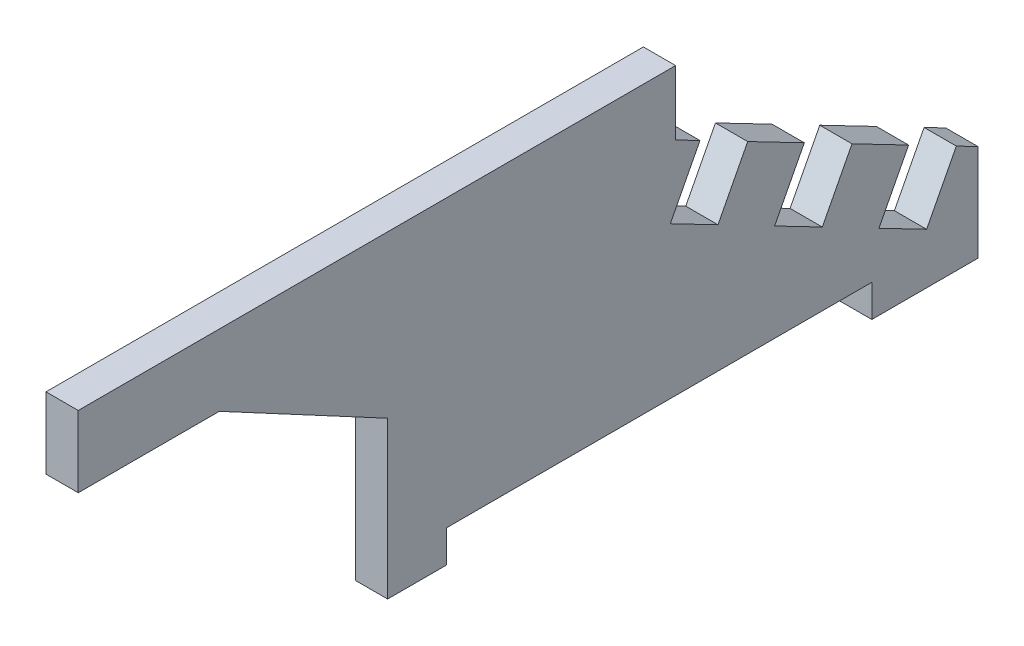
ISO-10303-21;
HEADER;
FILE_DESCRIPTION(('STEP AP214'),'2;1');
FILE_NAME('part.step','',(''),(''),'','','');
FILE_SCHEMA(('AUTOMOTIVE_DESIGN { 1 0 10303 214 1 1 1 1 }'));
ENDSEC;
DATA;
#1=APPLICATION_CONTEXT('core data for automotive mechanical design processes');
#2=APPLICATION_PROTOCOL_DEFINITION('international standard','automotive_design',2000,#1);
#3=PRODUCT_CONTEXT('',#1,'mechanical');
#4=PRODUCT('Part','Part','',(#3));
#5=PRODUCT_RELATED_PRODUCT_CATEGORY('part','',(#4));
#6=PRODUCT_DEFINITION_FORMATION('','',#4);
#7=PRODUCT_DEFINITION_CONTEXT('part definition',#1,'design');
#8=PRODUCT_DEFINITION('design','',#6,#7);
#9=PRODUCT_DEFINITION_SHAPE('','',#8);
#10=(LENGTH_UNIT() NAMED_UNIT(*) SI_UNIT(.MILLI.,.METRE.));
#11=(NAMED_UNIT(*) PLANE_ANGLE_UNIT() SI_UNIT($,.RADIAN.));
#12=(NAMED_UNIT(*) SI_UNIT($,.STERADIAN.) SOLID_ANGLE_UNIT());
#13=UNCERTAINTY_MEASURE_WITH_UNIT(LENGTH_MEASURE(1.E-05),#10,'distance_accuracy_value','');
#14=(GEOMETRIC_REPRESENTATION_CONTEXT(3) GLOBAL_UNCERTAINTY_ASSIGNED_CONTEXT((#13)) GLOBAL_UNIT_ASSIGNED_CONTEXT((#10,
#11,#12)) REPRESENTATION_CONTEXT('',''));
#15=CARTESIAN_POINT('',(0.,0.,0.));
#16=DIRECTION('',(0.,0.,1.));
#17=DIRECTION('',(1.,0.,0.));
#18=AXIS2_PLACEMENT_3D('',#15,#16,#17);
#19=CARTESIAN_POINT('',(3.,-19.9656088794069,23.405592814546));
#20=DIRECTION('',(0.,0.,-1.));
#21=DIRECTION('',(-1.,0.,0.));
#22=AXIS2_PLACEMENT_3D('',#19,#20,#21);
#23=PLANE('',#22);
#24=DIRECTION('',(0.,-1.,0.));
#25=VECTOR('',#24,1.);
#26=CARTESIAN_POINT('',(0.,-19.9656088794069,23.405592814546));
#27=LINE('',#26,#25);
#28=CARTESIAN_POINT('',(0.,-13.3287386111926,23.405592814546));
#29=VERTEX_POINT('',#28);
#30=CARTESIAN_POINT('',(0.,-19.9656088794069,23.405592814546));
#31=VERTEX_POINT('',#30);
#32=EDGE_CURVE('E276',#29,#31,#27,.T.);
#33=ORIENTED_EDGE('',*,*,#32,.T.);
#34=DIRECTION('',(-1.,0.,0.));
#35=VECTOR('',#34,1.);
#36=CARTESIAN_POINT('',(3.,-19.9656088794069,23.405592814546));
#37=LINE('',#36,#35);
#38=CARTESIAN_POINT('',(3.,-19.9656088794069,23.405592814546));
#39=VERTEX_POINT('',#38);
#40=EDGE_CURVE('E11',#39,#31,#37,.T.);
#41=ORIENTED_EDGE('',*,*,#40,.F.);
#42=DIRECTION('',(0.,-1.,0.));
#43=VECTOR('',#42,1.);
#44=CARTESIAN_POINT('',(3.,-19.9656088794069,23.405592814546));
#45=LINE('',#44,#43);
#46=CARTESIAN_POINT('',(3.,-13.3287386111926,23.405592814546));
#47=VERTEX_POINT('',#46);
#48=EDGE_CURVE('E343',#47,#39,#45,.T.);
#49=ORIENTED_EDGE('',*,*,#48,.F.);
#50=DIRECTION('',(-1.,0.,0.));
#51=VECTOR('',#50,1.);
#52=CARTESIAN_POINT('',(3.,-13.3287386111926,23.405592814546));
#53=LINE('',#52,#51);
#54=EDGE_CURVE('E272',#47,#29,#53,.T.);
#55=ORIENTED_EDGE('',*,*,#54,.T.);
#56=EDGE_LOOP('',(#33,#41,#49,#55));
#57=FACE_BOUND('',#56,.T.);
#58=ADVANCED_FACE('F39',(#57),#23,.F.);
#59=CARTESIAN_POINT('',(3.,-19.9656088794069,10.278235860692));
#60=DIRECTION('',(0.,1.,0.));
#61=DIRECTION('',(0.,0.,1.));
#62=AXIS2_PLACEMENT_3D('',#59,#60,#61);
#63=PLANE('',#62);
#64=DIRECTION('',(0.,0.,-1.));
#65=VECTOR('',#64,1.);
#66=CARTESIAN_POINT('',(0.,-19.9656088794069,10.278235860692));
#67=LINE('',#66,#65);
#68=CARTESIAN_POINT('',(0.,-19.9656088794069,10.278235860692));
#69=VERTEX_POINT('',#68);
#70=EDGE_CURVE('E280',#31,#69,#67,.T.);
#71=ORIENTED_EDGE('',*,*,#70,.T.);
#72=DIRECTION('',(-1.,0.,0.));
#73=VECTOR('',#72,1.);
#74=CARTESIAN_POINT('',(3.,-19.9656088794069,10.278235860692));
#75=LINE('',#74,#73);
#76=CARTESIAN_POINT('',(3.,-19.9656088794069,10.278235860692));
#77=VERTEX_POINT('',#76);
#78=EDGE_CURVE('E48',#77,#69,#75,.T.);
#79=ORIENTED_EDGE('',*,*,#78,.F.);
#80=DIRECTION('',(0.,0.,-1.));
#81=VECTOR('',#80,1.);
#82=CARTESIAN_POINT('',(3.,-19.9656088794069,10.278235860692));
#83=LINE('',#82,#81);
#84=EDGE_CURVE('E166',#39,#77,#83,.T.);
#85=ORIENTED_EDGE('',*,*,#84,.F.);
#86=ORIENTED_EDGE('',*,*,#40,.T.);
#87=EDGE_LOOP('',(#71,#79,#85,#86));
#88=FACE_BOUND('',#87,.T.);
#89=ADVANCED_FACE('F518',(#88),#63,.F.);
#90=CARTESIAN_POINT('',(3.,-28.3527475386568,-5.38733675730117));
#91=DIRECTION('',(0.,0.881600168687967,-0.471996973051044));
#92=DIRECTION('',(0.,0.471996973051044,0.881600168687967));
#93=AXIS2_PLACEMENT_3D('',#90,#91,#92);
#94=PLANE('',#93);
#95=DIRECTION('',(0.,-0.471996973051044,-0.881600168687967));
#96=VECTOR('',#95,1.);
#97=CARTESIAN_POINT('',(0.,-28.3527475386568,-5.38733675730117));
#98=LINE('',#97,#96);
#99=CARTESIAN_POINT('',(0.,-28.3527475386568,-5.38733675730117));
#100=VERTEX_POINT('',#99);
#101=EDGE_CURVE('E283',#69,#100,#98,.T.);
#102=ORIENTED_EDGE('',*,*,#101,.T.);
#103=DIRECTION('',(-1.,0.,0.));
#104=VECTOR('',#103,1.);
#105=CARTESIAN_POINT('',(3.,-28.3527475386568,-5.38733675730117));
#106=LINE('',#105,#104);
#107=CARTESIAN_POINT('',(3.,-28.3527475386568,-5.38733675730117));
#108=VERTEX_POINT('',#107);
#109=EDGE_CURVE('E416',#108,#100,#106,.T.);
#110=ORIENTED_EDGE('',*,*,#109,.F.);
#111=DIRECTION('',(0.,-0.471996973051044,-0.881600168687967));
#112=VECTOR('',#111,1.);
#113=CARTESIAN_POINT('',(3.,-28.3527475386568,-5.38733675730117));
#114=LINE('',#113,#112);
#115=EDGE_CURVE('E428',#77,#108,#114,.T.);
#116=ORIENTED_EDGE('',*,*,#115,.F.);
#117=ORIENTED_EDGE('',*,*,#78,.T.);
#118=EDGE_LOOP('',(#102,#110,#116,#117));
#119=FACE_BOUND('',#118,.T.);
#120=ADVANCED_FACE('F426',(#119),#94,.F.);
#121=CARTESIAN_POINT('',(3.,-39.9290637631004,-5.38733675730117));
#122=DIRECTION('',(0.,0.,-1.));
#123=DIRECTION('',(-1.,0.,0.));
#124=AXIS2_PLACEMENT_3D('',#121,#122,#123);
#125=PLANE('',#124);
#126=DIRECTION('',(0.,-1.,0.));
#127=VECTOR('',#126,1.);
#128=CARTESIAN_POINT('',(0.,-39.9290637631004,-5.38733675730117));
#129=LINE('',#128,#127);
#130=CARTESIAN_POINT('',(0.,-42.9290637631004,-5.38733675730117));
#131=VERTEX_POINT('',#130);
#132=EDGE_CURVE('E287',#100,#131,#129,.T.);
#133=ORIENTED_EDGE('',*,*,#132,.T.);
#134=DIRECTION('',(-1.,0.,0.));
#135=VECTOR('',#134,1.);
#136=CARTESIAN_POINT('',(3.,-42.9290637631004,-5.38733675730117));
#137=LINE('',#136,#135);
#138=CARTESIAN_POINT('',(3.,-42.9290637631004,-5.38733675730117));
#139=VERTEX_POINT('',#138);
#140=EDGE_CURVE('E412',#139,#131,#137,.T.);
#141=ORIENTED_EDGE('',*,*,#140,.F.);
#142=DIRECTION('',(0.,-1.,0.));
#143=VECTOR('',#142,1.);
#144=CARTESIAN_POINT('',(3.,-39.9290637631004,-5.38733675730117));
#145=LINE('',#144,#143);
#146=EDGE_CURVE('E446',#108,#139,#145,.T.);
#147=ORIENTED_EDGE('',*,*,#146,.F.);
#148=ORIENTED_EDGE('',*,*,#109,.T.);
#149=EDGE_LOOP('',(#133,#141,#147,#148));
#150=FACE_BOUND('',#149,.T.);
#151=ADVANCED_FACE('F436',(#150),#125,.F.);
#152=CARTESIAN_POINT('',(3.,-42.9290637631004,-5.38733675730117));
#153=DIRECTION('',(0.,1.,0.));
#154=DIRECTION('',(0.,0.,1.));
#155=AXIS2_PLACEMENT_3D('',#152,#153,#154);
#156=PLANE('',#155);
#157=DIRECTION('',(0.,0.,-1.));
#158=VECTOR('',#157,1.);
#159=CARTESIAN_POINT('',(0.,-42.9290637631004,-5.38733675730117));
#160=LINE('',#159,#158);
#161=CARTESIAN_POINT('',(0.,-42.9290637631004,-10.8500269527504));
#162=VERTEX_POINT('',#161);
#163=EDGE_CURVE('E290',#131,#162,#160,.T.);
#164=ORIENTED_EDGE('',*,*,#163,.T.);
#165=DIRECTION('',(-1.,0.,0.));
#166=VECTOR('',#165,1.);
#167=CARTESIAN_POINT('',(3.,-42.9290637631004,-10.8500269527504));
#168=LINE('',#167,#166);
#169=CARTESIAN_POINT('',(3.,-42.9290637631004,-10.8500269527504));
#170=VERTEX_POINT('',#169);
#171=EDGE_CURVE('E408',#170,#162,#168,.T.);
#172=ORIENTED_EDGE('',*,*,#171,.F.);
#173=DIRECTION('',(0.,0.,-1.));
#174=VECTOR('',#173,1.);
#175=CARTESIAN_POINT('',(3.,-42.9290637631004,-5.38733675730117));
#176=LINE('',#175,#174);
#177=EDGE_CURVE('E442',#139,#170,#176,.T.);
#178=ORIENTED_EDGE('',*,*,#177,.F.);
#179=ORIENTED_EDGE('',*,*,#140,.T.);
#180=EDGE_LOOP('',(#164,#172,#178,#179));
#181=FACE_BOUND('',#180,.T.);
#182=ADVANCED_FACE('F440',(#181),#156,.F.);
#183=CARTESIAN_POINT('',(3.,-39.9290637631004,-10.8500269527504));
#184=DIRECTION('',(0.,0.,1.));
#185=DIRECTION('',(1.,0.,0.));
#186=AXIS2_PLACEMENT_3D('',#183,#184,#185);
#187=PLANE('',#186);
#188=DIRECTION('',(0.,1.,0.));
#189=VECTOR('',#188,1.);
#190=CARTESIAN_POINT('',(0.,-39.9290637631004,-10.8500269527504));
#191=LINE('',#190,#189);
#192=CARTESIAN_POINT('',(0.,-39.9290637631004,-10.8500269527504));
#193=VERTEX_POINT('',#192);
#194=EDGE_CURVE('E293',#162,#193,#191,.T.);
#195=ORIENTED_EDGE('',*,*,#194,.T.);
#196=DIRECTION('',(-1.,0.,0.));
#197=VECTOR('',#196,1.);
#198=CARTESIAN_POINT('',(3.,-39.9290637631004,-10.8500269527504));
#199=LINE('',#198,#197);
#200=CARTESIAN_POINT('',(3.,-39.9290637631004,-10.8500269527504));
#201=VERTEX_POINT('',#200);
#202=EDGE_CURVE('E404',#201,#193,#199,.T.);
#203=ORIENTED_EDGE('',*,*,#202,.F.);
#204=DIRECTION('',(0.,1.,0.));
#205=VECTOR('',#204,1.);
#206=CARTESIAN_POINT('',(3.,-39.9290637631004,-10.8500269527504));
#207=LINE('',#206,#205);
#208=EDGE_CURVE('E445',#170,#201,#207,.T.);
#209=ORIENTED_EDGE('',*,*,#208,.F.);
#210=ORIENTED_EDGE('',*,*,#171,.T.);
#211=EDGE_LOOP('',(#195,#203,#209,#210));
#212=FACE_BOUND('',#211,.T.);
#213=ADVANCED_FACE('F531',(#212),#187,.F.);
#214=CARTESIAN_POINT('',(3.,-39.9290637631004,-50.4545308697576));
#215=DIRECTION('',(0.,1.,0.));
#216=DIRECTION('',(0.,0.,1.));
#217=AXIS2_PLACEMENT_3D('',#214,#215,#216);
#218=PLANE('',#217);
#219=DIRECTION('',(0.,0.,-1.));
#220=VECTOR('',#219,1.);
#221=CARTESIAN_POINT('',(0.,-39.9290637631004,-50.4545308697576));
#222=LINE('',#221,#220);
#223=CARTESIAN_POINT('',(0.,-39.9290637631004,-50.4545308697576));
#224=VERTEX_POINT('',#223);
#225=EDGE_CURVE('E296',#193,#224,#222,.T.);
#226=ORIENTED_EDGE('',*,*,#225,.T.);
#227=DIRECTION('',(-1.,0.,0.));
#228=VECTOR('',#227,1.);
#229=CARTESIAN_POINT('',(3.,-39.9290637631004,-50.4545308697576));
#230=LINE('',#229,#228);
#231=CARTESIAN_POINT('',(3.,-39.9290637631004,-50.4545308697576));
#232=VERTEX_POINT('',#231);
#233=EDGE_CURVE('E401',#232,#224,#230,.T.);
#234=ORIENTED_EDGE('',*,*,#233,.F.);
#235=DIRECTION('',(0.,0.,-1.));
#236=VECTOR('',#235,1.);
#237=CARTESIAN_POINT('',(3.,-39.9290637631004,-50.4545308697576));
#238=LINE('',#237,#236);
#239=EDGE_CURVE('E449',#201,#232,#238,.T.);
#240=ORIENTED_EDGE('',*,*,#239,.F.);
#241=ORIENTED_EDGE('',*,*,#202,.T.);
#242=EDGE_LOOP('',(#226,#234,#240,#241));
#243=FACE_BOUND('',#242,.T.);
#244=ADVANCED_FACE('F534',(#243),#218,.F.);
#245=CARTESIAN_POINT('',(3.,-39.9290637631004,-50.4545308697576));
#246=DIRECTION('',(0.,0.,-1.));
#247=DIRECTION('',(-1.,0.,0.));
#248=AXIS2_PLACEMENT_3D('',#245,#246,#247);
#249=PLANE('',#248);
#250=DIRECTION('',(0.,-1.,0.));
#251=VECTOR('',#250,1.);
#252=CARTESIAN_POINT('',(0.,-39.9290637631004,-50.4545308697576));
#253=LINE('',#252,#251);
#254=CARTESIAN_POINT('',(0.,-42.9290637631004,-50.4545308697576));
#255=VERTEX_POINT('',#254);
#256=EDGE_CURVE('E299',#224,#255,#253,.T.);
#257=ORIENTED_EDGE('',*,*,#256,.T.);
#258=DIRECTION('',(-1.,0.,0.));
#259=VECTOR('',#258,1.);
#260=CARTESIAN_POINT('',(3.,-42.9290637631004,-50.4545308697576));
#261=LINE('',#260,#259);
#262=CARTESIAN_POINT('',(3.,-42.9290637631004,-50.4545308697576));
#263=VERTEX_POINT('',#262);
#264=EDGE_CURVE('E398',#263,#255,#261,.T.);
#265=ORIENTED_EDGE('',*,*,#264,.F.);
#266=DIRECTION('',(0.,-1.,0.));
#267=VECTOR('',#266,1.);
#268=CARTESIAN_POINT('',(3.,-39.9290637631004,-50.4545308697576));
#269=LINE('',#268,#267);
#270=EDGE_CURVE('E456',#232,#263,#269,.T.);
#271=ORIENTED_EDGE('',*,*,#270,.F.);
#272=ORIENTED_EDGE('',*,*,#233,.T.);
#273=EDGE_LOOP('',(#257,#265,#271,#272));
#274=FACE_BOUND('',#273,.T.);
#275=ADVANCED_FACE('F538',(#274),#249,.F.);
#276=CARTESIAN_POINT('',(3.,-42.9290637631004,-50.4545308697576));
#277=DIRECTION('',(0.,1.,0.));
#278=DIRECTION('',(0.,0.,1.));
#279=AXIS2_PLACEMENT_3D('',#276,#277,#278);
#280=PLANE('',#279);
#281=DIRECTION('',(0.,0.,-1.));
#282=VECTOR('',#281,1.);
#283=CARTESIAN_POINT('',(0.,-42.9290637631004,-50.4545308697576));
#284=LINE('',#283,#282);
#285=CARTESIAN_POINT('',(0.,-42.9290637631004,-60.3362108869641));
#286=VERTEX_POINT('',#285);
#287=EDGE_CURVE('E301',#255,#286,#284,.T.);
#288=ORIENTED_EDGE('',*,*,#287,.T.);
#289=DIRECTION('',(-1.,0.,0.));
#290=VECTOR('',#289,1.);
#291=CARTESIAN_POINT('',(3.,-42.9290637631004,-60.3362108869641));
#292=LINE('',#291,#290);
#293=CARTESIAN_POINT('',(3.,-42.9290637631004,-60.3362108869641));
#294=VERTEX_POINT('',#293);
#295=EDGE_CURVE('E394',#294,#286,#292,.T.);
#296=ORIENTED_EDGE('',*,*,#295,.F.);
#297=DIRECTION('',(0.,0.,-1.));
#298=VECTOR('',#297,1.);
#299=CARTESIAN_POINT('',(3.,-42.9290637631004,-50.4545308697576));
#300=LINE('',#299,#298);
#301=EDGE_CURVE('E458',#263,#294,#300,.T.);
#302=ORIENTED_EDGE('',*,*,#301,.F.);
#303=ORIENTED_EDGE('',*,*,#264,.T.);
#304=EDGE_LOOP('',(#288,#296,#302,#303));
#305=FACE_BOUND('',#304,.T.);
#306=ADVANCED_FACE('F542',(#305),#280,.F.);
#307=CARTESIAN_POINT('',(3.,-33.9290637631004,-60.3362108869641));
#308=DIRECTION('',(0.,0.,1.));
#309=DIRECTION('',(1.,0.,0.));
#310=AXIS2_PLACEMENT_3D('',#307,#308,#309);
#311=PLANE('',#310);
#312=DIRECTION('',(0.,1.,0.));
#313=VECTOR('',#312,1.);
#314=CARTESIAN_POINT('',(0.,-33.9290637631004,-60.3362108869641));
#315=LINE('',#314,#313);
#316=CARTESIAN_POINT('',(0.,-33.9290637631004,-60.3362108869641));
#317=VERTEX_POINT('',#316);
#318=EDGE_CURVE('E304',#286,#317,#315,.T.);
#319=ORIENTED_EDGE('',*,*,#318,.T.);
#320=DIRECTION('',(-1.,0.,0.));
#321=VECTOR('',#320,1.);
#322=CARTESIAN_POINT('',(3.,-33.9290637631004,-60.3362108869641));
#323=LINE('',#322,#321);
#324=CARTESIAN_POINT('',(3.,-33.9290637631004,-60.3362108869641));
#325=VERTEX_POINT('',#324);
#326=EDGE_CURVE('E390',#325,#317,#323,.T.);
#327=ORIENTED_EDGE('',*,*,#326,.F.);
#328=DIRECTION('',(0.,1.,0.));
#329=VECTOR('',#328,1.);
#330=CARTESIAN_POINT('',(3.,-39.9290637631004,-60.3362108869641));
#331=LINE('',#330,#329);
#332=EDGE_CURVE('E461',#294,#325,#331,.T.);
#333=ORIENTED_EDGE('',*,*,#332,.F.);
#334=ORIENTED_EDGE('',*,*,#295,.T.);
#335=EDGE_LOOP('',(#319,#327,#333,#334));
#336=FACE_BOUND('',#335,.T.);
#337=ADVANCED_FACE('F546',(#336),#311,.F.);
#338=CARTESIAN_POINT('',(3.,-32.8821418997589,-58.318179141275));
#339=DIRECTION('',(0.,-0.887658340246798,0.460502628646461));
#340=DIRECTION('',(0.,-0.460502628646461,-0.887658340246798));
#341=AXIS2_PLACEMENT_3D('',#338,#339,#340);
#342=PLANE('',#341);
#343=DIRECTION('',(0.,0.460502628646461,0.887658340246798));
#344=VECTOR('',#343,1.);
#345=CARTESIAN_POINT('',(0.,-32.8821418997589,-58.318179141275));
#346=LINE('',#345,#344);
#347=CARTESIAN_POINT('',(0.,-32.8821418997589,-58.318179141275));
#348=VERTEX_POINT('',#347);
#349=EDGE_CURVE('E306',#317,#348,#346,.T.);
#350=ORIENTED_EDGE('',*,*,#349,.T.);
#351=DIRECTION('',(-1.,0.,0.));
#352=VECTOR('',#351,1.);
#353=CARTESIAN_POINT('',(3.,-32.8821418997589,-58.318179141275));
#354=LINE('',#353,#352);
#355=CARTESIAN_POINT('',(3.,-32.8821418997589,-58.318179141275));
#356=VERTEX_POINT('',#355);
#357=EDGE_CURVE('E386',#356,#348,#354,.T.);
#358=ORIENTED_EDGE('',*,*,#357,.F.);
#359=DIRECTION('',(0.,0.460502628646461,0.887658340246798));
#360=VECTOR('',#359,1.);
#361=CARTESIAN_POINT('',(3.,-32.8821418997589,-58.318179141275));
#362=LINE('',#361,#360);
#363=EDGE_CURVE('E464',#325,#356,#362,.T.);
#364=ORIENTED_EDGE('',*,*,#363,.F.);
#365=ORIENTED_EDGE('',*,*,#326,.T.);
#366=EDGE_LOOP('',(#350,#358,#364,#365));
#367=FACE_BOUND('',#366,.T.);
#368=ADVANCED_FACE('F550',(#367),#342,.F.);
#369=CARTESIAN_POINT('',(3.,-32.8821418997589,-58.318179141275));
#370=DIRECTION('',(0.,-0.460502628646458,-0.887658340246799));
#371=DIRECTION('',(0.,0.887658340246799,-0.460502628646458));
#372=AXIS2_PLACEMENT_3D('',#369,#370,#371);
#373=PLANE('',#372);
#374=DIRECTION('',(0.,-0.887658340246799,0.460502628646458));
#375=VECTOR('',#374,1.);
#376=CARTESIAN_POINT('',(0.,-32.8821418997589,-58.318179141275));
#377=LINE('',#376,#375);
#378=CARTESIAN_POINT('',(0.,-38.2080919412397,-55.5551633693962));
#379=VERTEX_POINT('',#378);
#380=EDGE_CURVE('E308',#348,#379,#377,.T.);
#381=ORIENTED_EDGE('',*,*,#380,.T.);
#382=DIRECTION('',(-1.,0.,0.));
#383=VECTOR('',#382,1.);
#384=CARTESIAN_POINT('',(3.,-38.2080919412397,-55.5551633693962));
#385=LINE('',#384,#383);
#386=CARTESIAN_POINT('',(3.,-38.2080919412397,-55.5551633693962));
#387=VERTEX_POINT('',#386);
#388=EDGE_CURVE('E382',#387,#379,#385,.T.);
#389=ORIENTED_EDGE('',*,*,#388,.F.);
#390=DIRECTION('',(0.,-0.887658340246799,0.460502628646458));
#391=VECTOR('',#390,1.);
#392=CARTESIAN_POINT('',(3.,-32.8821418997589,-58.318179141275));
#393=LINE('',#392,#391);
#394=EDGE_CURVE('E467',#356,#387,#393,.T.);
#395=ORIENTED_EDGE('',*,*,#394,.F.);
#396=ORIENTED_EDGE('',*,*,#357,.T.);
#397=EDGE_LOOP('',(#381,#389,#395,#396));
#398=FACE_BOUND('',#397,.T.);
#399=ADVANCED_FACE('F554',(#398),#373,.F.);
#400=CARTESIAN_POINT('',(3.,-35.9055787996438,-51.1168716713165));
#401=DIRECTION('',(0.,-0.887658340246799,0.460502628646459));
#402=DIRECTION('',(0.,-0.460502628646459,-0.887658340246799));
#403=AXIS2_PLACEMENT_3D('',#400,#401,#402);
#404=PLANE('',#403);
#405=DIRECTION('',(0.,0.460502628646459,0.887658340246799));
#406=VECTOR('',#405,1.);
#407=CARTESIAN_POINT('',(0.,-35.9055787996438,-51.1168716713165));
#408=LINE('',#407,#406);
#409=CARTESIAN_POINT('',(0.,-35.9055787996438,-51.1168716713165));
#410=VERTEX_POINT('',#409);
#411=EDGE_CURVE('E310',#379,#410,#408,.T.);
#412=ORIENTED_EDGE('',*,*,#411,.T.);
#413=DIRECTION('',(-1.,0.,0.));
#414=VECTOR('',#413,1.);
#415=CARTESIAN_POINT('',(3.,-35.9055787996438,-51.1168716713165));
#416=LINE('',#415,#414);
#417=CARTESIAN_POINT('',(3.,-35.9055787996438,-51.1168716713165));
#418=VERTEX_POINT('',#417);
#419=EDGE_CURVE('E379',#418,#410,#416,.T.);
#420=ORIENTED_EDGE('',*,*,#419,.F.);
#421=DIRECTION('',(0.,0.460502628646459,0.887658340246799));
#422=VECTOR('',#421,1.);
#423=CARTESIAN_POINT('',(3.,-35.9055787996438,-51.1168716713165));
#424=LINE('',#423,#422);
#425=EDGE_CURVE('E470',#387,#418,#424,.T.);
#426=ORIENTED_EDGE('',*,*,#425,.F.);
#427=ORIENTED_EDGE('',*,*,#388,.T.);
#428=EDGE_LOOP('',(#412,#420,#426,#427));
#429=FACE_BOUND('',#428,.T.);
#430=ADVANCED_FACE('F558',(#429),#404,.F.);
#431=CARTESIAN_POINT('',(3.,-30.579628758163,-53.8798874431953));
#432=DIRECTION('',(0.,0.460502628646461,0.887658340246798));
#433=DIRECTION('',(0.,-0.887658340246798,0.460502628646461));
#434=AXIS2_PLACEMENT_3D('',#431,#432,#433);
#435=PLANE('',#434);
#436=DIRECTION('',(0.,0.887658340246798,-0.460502628646461));
#437=VECTOR('',#436,1.);
#438=CARTESIAN_POINT('',(0.,-30.579628758163,-53.8798874431953));
#439=LINE('',#438,#437);
#440=CARTESIAN_POINT('',(0.,-30.579628758163,-53.8798874431953));
#441=VERTEX_POINT('',#440);
#442=EDGE_CURVE('E312',#410,#441,#439,.T.);
#443=ORIENTED_EDGE('',*,*,#442,.T.);
#444=DIRECTION('',(-1.,0.,0.));
#445=VECTOR('',#444,1.);
#446=CARTESIAN_POINT('',(3.,-30.579628758163,-53.8798874431953));
#447=LINE('',#446,#445);
#448=CARTESIAN_POINT('',(3.,-30.579628758163,-53.8798874431953));
#449=VERTEX_POINT('',#448);
#450=EDGE_CURVE('E375',#449,#441,#447,.T.);
#451=ORIENTED_EDGE('',*,*,#450,.F.);
#452=DIRECTION('',(0.,0.887658340246798,-0.460502628646461));
#453=VECTOR('',#452,1.);
#454=CARTESIAN_POINT('',(3.,-30.579628758163,-53.8798874431953));
#455=LINE('',#454,#453);
#456=EDGE_CURVE('E473',#418,#449,#455,.T.);
#457=ORIENTED_EDGE('',*,*,#456,.F.);
#458=ORIENTED_EDGE('',*,*,#419,.T.);
#459=EDGE_LOOP('',(#443,#451,#457,#458));
#460=FACE_BOUND('',#459,.T.);
#461=ADVANCED_FACE('F562',(#460),#435,.F.);
#462=CARTESIAN_POINT('',(3.,-27.845373968073,-48.6093766625794));
#463=DIRECTION('',(0.,-0.887658340246799,0.460502628646459));
#464=DIRECTION('',(0.,-0.460502628646459,-0.887658340246799));
#465=AXIS2_PLACEMENT_3D('',#462,#463,#464);
#466=PLANE('',#465);
#467=DIRECTION('',(0.,0.460502628646459,0.887658340246799));
#468=VECTOR('',#467,1.);
#469=CARTESIAN_POINT('',(0.,-27.845373968073,-48.6093766625794));
#470=LINE('',#469,#468);
#471=CARTESIAN_POINT('',(0.,-27.845373968073,-48.6093766625794));
#472=VERTEX_POINT('',#471);
#473=EDGE_CURVE('E314',#441,#472,#470,.T.);
#474=ORIENTED_EDGE('',*,*,#473,.T.);
#475=DIRECTION('',(-1.,0.,0.));
#476=VECTOR('',#475,1.);
#477=CARTESIAN_POINT('',(3.,-27.845373968073,-48.6093766625794));
#478=LINE('',#477,#476);
#479=CARTESIAN_POINT('',(3.,-27.845373968073,-48.6093766625794));
#480=VERTEX_POINT('',#479);
#481=EDGE_CURVE('E371',#480,#472,#478,.T.);
#482=ORIENTED_EDGE('',*,*,#481,.F.);
#483=DIRECTION('',(0.,0.460502628646459,0.887658340246799));
#484=VECTOR('',#483,1.);
#485=CARTESIAN_POINT('',(3.,-27.845373968073,-48.6093766625794));
#486=LINE('',#485,#484);
#487=EDGE_CURVE('E476',#449,#480,#486,.T.);
#488=ORIENTED_EDGE('',*,*,#487,.F.);
#489=ORIENTED_EDGE('',*,*,#450,.T.);
#490=EDGE_LOOP('',(#474,#482,#488,#489));
#491=FACE_BOUND('',#490,.T.);
#492=ADVANCED_FACE('F566',(#491),#466,.F.);
#493=CARTESIAN_POINT('',(3.,-27.845373968073,-48.6093766625794));
#494=DIRECTION('',(0.,-0.460502628646457,-0.8876583402468));
#495=DIRECTION('',(0.,0.8876583402468,-0.460502628646457));
#496=AXIS2_PLACEMENT_3D('',#493,#494,#495);
#497=PLANE('',#496);
#498=DIRECTION('',(0.,-0.8876583402468,0.460502628646457));
#499=VECTOR('',#498,1.);
#500=CARTESIAN_POINT('',(0.,-27.845373968073,-48.6093766625794));
#501=LINE('',#500,#499);
#502=CARTESIAN_POINT('',(0.,-33.1713240095538,-45.8463608907006));
#503=VERTEX_POINT('',#502);
#504=EDGE_CURVE('E317',#472,#503,#501,.T.);
#505=ORIENTED_EDGE('',*,*,#504,.T.);
#506=DIRECTION('',(-1.,0.,0.));
#507=VECTOR('',#506,1.);
#508=CARTESIAN_POINT('',(3.,-33.1713240095538,-45.8463608907006));
#509=LINE('',#508,#507);
#510=CARTESIAN_POINT('',(3.,-33.1713240095538,-45.8463608907006));
#511=VERTEX_POINT('',#510);
#512=EDGE_CURVE('E368',#511,#503,#509,.T.);
#513=ORIENTED_EDGE('',*,*,#512,.F.);
#514=DIRECTION('',(0.,-0.8876583402468,0.460502628646457));
#515=VECTOR('',#514,1.);
#516=CARTESIAN_POINT('',(3.,-27.845373968073,-48.6093766625794));
#517=LINE('',#516,#515);
#518=EDGE_CURVE('E479',#480,#511,#517,.T.);
#519=ORIENTED_EDGE('',*,*,#518,.F.);
#520=ORIENTED_EDGE('',*,*,#481,.T.);
#521=EDGE_LOOP('',(#505,#513,#519,#520));
#522=FACE_BOUND('',#521,.T.);
#523=ADVANCED_FACE('F570',(#522),#497,.F.);
#524=CARTESIAN_POINT('',(3.,-30.868810868498,-41.4080691936621));
#525=DIRECTION('',(0.,-0.887658340246799,0.460502628646458));
#526=DIRECTION('',(0.,-0.460502628646458,-0.887658340246799));
#527=AXIS2_PLACEMENT_3D('',#524,#525,#526);
#528=PLANE('',#527);
#529=DIRECTION('',(0.,0.460502628646458,0.887658340246799));
#530=VECTOR('',#529,1.);
#531=CARTESIAN_POINT('',(0.,-30.868810868498,-41.4080691936621));
#532=LINE('',#531,#530);
#533=CARTESIAN_POINT('',(0.,-30.868810868498,-41.4080691936621));
#534=VERTEX_POINT('',#533);
#535=EDGE_CURVE('E320',#503,#534,#532,.T.);
#536=ORIENTED_EDGE('',*,*,#535,.T.);
#537=DIRECTION('',(-1.,0.,0.));
#538=VECTOR('',#537,1.);
#539=CARTESIAN_POINT('',(3.,-30.868810868498,-41.4080691936621));
#540=LINE('',#539,#538);
#541=CARTESIAN_POINT('',(3.,-30.868810868498,-41.4080691936621));
#542=VERTEX_POINT('',#541);
#543=EDGE_CURVE('E365',#542,#534,#540,.T.);
#544=ORIENTED_EDGE('',*,*,#543,.F.);
#545=DIRECTION('',(0.,0.460502628646458,0.887658340246799));
#546=VECTOR('',#545,1.);
#547=CARTESIAN_POINT('',(3.,-30.868810868498,-41.4080691936621));
#548=LINE('',#547,#546);
#549=EDGE_CURVE('E482',#511,#542,#548,.T.);
#550=ORIENTED_EDGE('',*,*,#549,.F.);
#551=ORIENTED_EDGE('',*,*,#512,.T.);
#552=EDGE_LOOP('',(#536,#544,#550,#551));
#553=FACE_BOUND('',#552,.T.);
#554=ADVANCED_FACE('F574',(#553),#528,.F.);
#555=CARTESIAN_POINT('',(3.,-25.5428608270172,-44.1710849655408));
#556=DIRECTION('',(0.,0.460502628646458,0.887658340246799));
#557=DIRECTION('',(0.,-0.887658340246799,0.460502628646458));
#558=AXIS2_PLACEMENT_3D('',#555,#556,#557);
#559=PLANE('',#558);
#560=DIRECTION('',(0.,0.887658340246799,-0.460502628646458));
#561=VECTOR('',#560,1.);
#562=CARTESIAN_POINT('',(0.,-25.5428608270172,-44.1710849655408));
#563=LINE('',#562,#561);
#564=CARTESIAN_POINT('',(0.,-25.5428608270172,-44.1710849655408));
#565=VERTEX_POINT('',#564);
#566=EDGE_CURVE('E322',#534,#565,#563,.T.);
#567=ORIENTED_EDGE('',*,*,#566,.T.);
#568=DIRECTION('',(-1.,0.,0.));
#569=VECTOR('',#568,1.);
#570=CARTESIAN_POINT('',(3.,-25.5428608270172,-44.1710849655408));
#571=LINE('',#570,#569);
#572=CARTESIAN_POINT('',(3.,-25.5428608270172,-44.1710849655408));
#573=VERTEX_POINT('',#572);
#574=EDGE_CURVE('E361',#573,#565,#571,.T.);
#575=ORIENTED_EDGE('',*,*,#574,.F.);
#576=DIRECTION('',(0.,0.887658340246799,-0.460502628646458));
#577=VECTOR('',#576,1.);
#578=CARTESIAN_POINT('',(3.,-25.5428608270172,-44.1710849655408));
#579=LINE('',#578,#577);
#580=EDGE_CURVE('E484',#542,#573,#579,.T.);
#581=ORIENTED_EDGE('',*,*,#580,.F.);
#582=ORIENTED_EDGE('',*,*,#543,.T.);
#583=EDGE_LOOP('',(#567,#575,#581,#582));
#584=FACE_BOUND('',#583,.T.);
#585=ADVANCED_FACE('F578',(#584),#559,.F.);
#586=CARTESIAN_POINT('',(3.,-22.8086060369273,-38.9005741849249));
#587=DIRECTION('',(0.,-0.887658340246799,0.460502628646458));
#588=DIRECTION('',(0.,-0.460502628646458,-0.887658340246799));
#589=AXIS2_PLACEMENT_3D('',#586,#587,#588);
#590=PLANE('',#589);
#591=DIRECTION('',(0.,0.460502628646458,0.887658340246799));
#592=VECTOR('',#591,1.);
#593=CARTESIAN_POINT('',(0.,-22.8086060369273,-38.9005741849249));
#594=LINE('',#593,#592);
#595=CARTESIAN_POINT('',(0.,-22.8086060369273,-38.9005741849249));
#596=VERTEX_POINT('',#595);
#597=EDGE_CURVE('E325',#565,#596,#594,.T.);
#598=ORIENTED_EDGE('',*,*,#597,.T.);
#599=DIRECTION('',(-1.,0.,0.));
#600=VECTOR('',#599,1.);
#601=CARTESIAN_POINT('',(3.,-22.8086060369273,-38.9005741849249));
#602=LINE('',#601,#600);
#603=CARTESIAN_POINT('',(3.,-22.8086060369273,-38.9005741849249));
#604=VERTEX_POINT('',#603);
#605=EDGE_CURVE('E357',#604,#596,#602,.T.);
#606=ORIENTED_EDGE('',*,*,#605,.F.);
#607=DIRECTION('',(0.,0.460502628646458,0.887658340246799));
#608=VECTOR('',#607,1.);
#609=CARTESIAN_POINT('',(3.,-22.8086060369273,-38.9005741849249));
#610=LINE('',#609,#608);
#611=EDGE_CURVE('E487',#573,#604,#610,.T.);
#612=ORIENTED_EDGE('',*,*,#611,.F.);
#613=ORIENTED_EDGE('',*,*,#574,.T.);
#614=EDGE_LOOP('',(#598,#606,#612,#613));
#615=FACE_BOUND('',#614,.T.);
#616=ADVANCED_FACE('F582',(#615),#590,.F.);
#617=CARTESIAN_POINT('',(3.,-22.8086060369273,-38.9005741849249));
#618=DIRECTION('',(0.,-0.460502628646458,-0.887658340246799));
#619=DIRECTION('',(0.,0.887658340246799,-0.460502628646458));
#620=AXIS2_PLACEMENT_3D('',#617,#618,#619);
#621=PLANE('',#620);
#622=DIRECTION('',(0.,-0.887658340246799,0.460502628646458));
#623=VECTOR('',#622,1.);
#624=CARTESIAN_POINT('',(0.,-22.8086060369273,-38.9005741849249));
#625=LINE('',#624,#623);
#626=CARTESIAN_POINT('',(0.,-28.1345560784081,-36.1375584130461));
#627=VERTEX_POINT('',#626);
#628=EDGE_CURVE('E328',#596,#627,#625,.T.);
#629=ORIENTED_EDGE('',*,*,#628,.T.);
#630=DIRECTION('',(-1.,0.,0.));
#631=VECTOR('',#630,1.);
#632=CARTESIAN_POINT('',(3.,-28.1345560784081,-36.1375584130461));
#633=LINE('',#632,#631);
#634=CARTESIAN_POINT('',(3.,-28.1345560784081,-36.1375584130461));
#635=VERTEX_POINT('',#634);
#636=EDGE_CURVE('E353',#635,#627,#633,.T.);
#637=ORIENTED_EDGE('',*,*,#636,.F.);
#638=DIRECTION('',(0.,-0.887658340246799,0.460502628646458));
#639=VECTOR('',#638,1.);
#640=CARTESIAN_POINT('',(3.,-22.8086060369273,-38.9005741849249));
#641=LINE('',#640,#639);
#642=EDGE_CURVE('E490',#604,#635,#641,.T.);
#643=ORIENTED_EDGE('',*,*,#642,.F.);
#644=ORIENTED_EDGE('',*,*,#605,.T.);
#645=EDGE_LOOP('',(#629,#637,#643,#644));
#646=FACE_BOUND('',#645,.T.);
#647=ADVANCED_FACE('F586',(#646),#621,.F.);
#648=CARTESIAN_POINT('',(3.,-25.8320429351758,-31.6992667118121));
#649=DIRECTION('',(0.,-0.887658340246799,0.460502628646458));
#650=DIRECTION('',(0.,-0.460502628646458,-0.887658340246799));
#651=AXIS2_PLACEMENT_3D('',#648,#649,#650);
#652=PLANE('',#651);
#653=DIRECTION('',(0.,0.460502628646458,0.887658340246799));
#654=VECTOR('',#653,1.);
#655=CARTESIAN_POINT('',(0.,-25.8320429351758,-31.6992667118121));
#656=LINE('',#655,#654);
#657=CARTESIAN_POINT('',(0.,-25.8320429351758,-31.6992667118121));
#658=VERTEX_POINT('',#657);
#659=EDGE_CURVE('E331',#627,#658,#656,.T.);
#660=ORIENTED_EDGE('',*,*,#659,.T.);
#661=DIRECTION('',(-1.,0.,0.));
#662=VECTOR('',#661,1.);
#663=CARTESIAN_POINT('',(3.,-25.8320429351758,-31.6992667118121));
#664=LINE('',#663,#662);
#665=CARTESIAN_POINT('',(3.,-25.8320429351758,-31.6992667118121));
#666=VERTEX_POINT('',#665);
#667=EDGE_CURVE('E349',#666,#658,#664,.T.);
#668=ORIENTED_EDGE('',*,*,#667,.F.);
#669=DIRECTION('',(0.,0.460502628646458,0.887658340246799));
#670=VECTOR('',#669,1.);
#671=CARTESIAN_POINT('',(3.,-25.8320429351758,-31.6992667118121));
#672=LINE('',#671,#670);
#673=EDGE_CURVE('E493',#635,#666,#672,.T.);
#674=ORIENTED_EDGE('',*,*,#673,.F.);
#675=ORIENTED_EDGE('',*,*,#636,.T.);
#676=EDGE_LOOP('',(#660,#668,#674,#675));
#677=FACE_BOUND('',#676,.T.);
#678=ADVANCED_FACE('F499',(#677),#652,.F.);
#679=CARTESIAN_POINT('',(3.,-20.506092893695,-34.4622824836909));
#680=DIRECTION('',(0.,0.460502628646458,0.887658340246799));
#681=DIRECTION('',(0.,-0.887658340246799,0.460502628646458));
#682=AXIS2_PLACEMENT_3D('',#679,#680,#681);
#683=PLANE('',#682);
#684=DIRECTION('',(0.,0.887658340246799,-0.460502628646458));
#685=VECTOR('',#684,1.);
#686=CARTESIAN_POINT('',(0.,-20.506092893695,-34.4622824836909));
#687=LINE('',#686,#685);
#688=CARTESIAN_POINT('',(0.,-20.506092893695,-34.4622824836909));
#689=VERTEX_POINT('',#688);
#690=EDGE_CURVE('E334',#658,#689,#687,.T.);
#691=ORIENTED_EDGE('',*,*,#690,.T.);
#692=DIRECTION('',(-1.,0.,0.));
#693=VECTOR('',#692,1.);
#694=CARTESIAN_POINT('',(3.,-20.506092893695,-34.4622824836909));
#695=LINE('',#694,#693);
#696=CARTESIAN_POINT('',(3.,-20.506092893695,-34.4622824836909));
#697=VERTEX_POINT('',#696);
#698=EDGE_CURVE('E263',#697,#689,#695,.T.);
#699=ORIENTED_EDGE('',*,*,#698,.F.);
#700=DIRECTION('',(0.,0.887658340246799,-0.460502628646458));
#701=VECTOR('',#700,1.);
#702=CARTESIAN_POINT('',(3.,-20.506092893695,-34.4622824836909));
#703=LINE('',#702,#701);
#704=EDGE_CURVE('E252',#666,#697,#703,.T.);
#705=ORIENTED_EDGE('',*,*,#704,.F.);
#706=ORIENTED_EDGE('',*,*,#667,.T.);
#707=EDGE_LOOP('',(#691,#699,#705,#706));
#708=FACE_BOUND('',#707,.T.);
#709=ADVANCED_FACE('F503',(#708),#683,.F.);
#710=CARTESIAN_POINT('',(3.,-19.3287386111926,-32.192831055454));
#711=DIRECTION('',(0.,-0.8876583402468,0.460502628646457));
#712=DIRECTION('',(0.,-0.460502628646457,-0.8876583402468));
#713=AXIS2_PLACEMENT_3D('',#710,#711,#712);
#714=PLANE('',#713);
#715=DIRECTION('',(0.,0.460502628646457,0.8876583402468));
#716=VECTOR('',#715,1.);
#717=CARTESIAN_POINT('',(0.,-19.3287386111926,-32.192831055454));
#718=LINE('',#717,#716);
#719=CARTESIAN_POINT('',(0.,-19.3287386111926,-32.192831055454));
#720=VERTEX_POINT('',#719);
#721=EDGE_CURVE('E261',#689,#720,#718,.T.);
#722=ORIENTED_EDGE('',*,*,#721,.T.);
#723=DIRECTION('',(-1.,0.,0.));
#724=VECTOR('',#723,1.);
#725=CARTESIAN_POINT('',(3.,-19.3287386111926,-32.192831055454));
#726=LINE('',#725,#724);
#727=CARTESIAN_POINT('',(3.,-19.3287386111926,-32.192831055454));
#728=VERTEX_POINT('',#727);
#729=EDGE_CURVE('E258',#728,#720,#726,.T.);
#730=ORIENTED_EDGE('',*,*,#729,.F.);
#731=DIRECTION('',(0.,0.460502628646457,0.8876583402468));
#732=VECTOR('',#731,1.);
#733=CARTESIAN_POINT('',(3.,-19.3287386111926,-32.192831055454));
#734=LINE('',#733,#732);
#735=EDGE_CURVE('E246',#697,#728,#734,.T.);
#736=ORIENTED_EDGE('',*,*,#735,.F.);
#737=ORIENTED_EDGE('',*,*,#698,.T.);
#738=EDGE_LOOP('',(#722,#730,#736,#737));
#739=FACE_BOUND('',#738,.T.);
#740=ADVANCED_FACE('F259',(#739),#714,.F.);
#741=CARTESIAN_POINT('',(3.,-13.3287386111926,-32.192831055454));
#742=DIRECTION('',(0.,0.,1.));
#743=DIRECTION('',(1.,0.,0.));
#744=AXIS2_PLACEMENT_3D('',#741,#742,#743);
#745=PLANE('',#744);
#746=DIRECTION('',(0.,1.,0.));
#747=VECTOR('',#746,1.);
#748=CARTESIAN_POINT('',(0.,-13.3287386111926,-32.192831055454));
#749=LINE('',#748,#747);
#750=CARTESIAN_POINT('',(0.,-13.3287386111926,-32.192831055454));
#751=VERTEX_POINT('',#750);
#752=EDGE_CURVE('E152',#720,#751,#749,.T.);
#753=ORIENTED_EDGE('',*,*,#752,.T.);
#754=DIRECTION('',(-1.,0.,0.));
#755=VECTOR('',#754,1.);
#756=CARTESIAN_POINT('',(3.,-13.3287386111926,-32.192831055454));
#757=LINE('',#756,#755);
#758=CARTESIAN_POINT('',(3.,-13.3287386111926,-32.192831055454));
#759=VERTEX_POINT('',#758);
#760=EDGE_CURVE('E264',#759,#751,#757,.T.);
#761=ORIENTED_EDGE('',*,*,#760,.F.);
#762=DIRECTION('',(0.,1.,0.));
#763=VECTOR('',#762,1.);
#764=CARTESIAN_POINT('',(3.,-13.3287386111926,-32.192831055454));
#765=LINE('',#764,#763);
#766=EDGE_CURVE('E250',#728,#759,#765,.T.);
#767=ORIENTED_EDGE('',*,*,#766,.F.);
#768=ORIENTED_EDGE('',*,*,#729,.T.);
#769=EDGE_LOOP('',(#753,#761,#767,#768));
#770=FACE_BOUND('',#769,.T.);
#771=ADVANCED_FACE('F266',(#770),#745,.F.);
#772=CARTESIAN_POINT('',(3.,-13.3287386111926,23.405592814546));
#773=DIRECTION('',(0.,-1.,0.));
#774=DIRECTION('',(0.,0.,-1.));
#775=AXIS2_PLACEMENT_3D('',#772,#773,#774);
#776=PLANE('',#775);
#777=DIRECTION('',(0.,0.,1.));
#778=VECTOR('',#777,1.);
#779=CARTESIAN_POINT('',(0.,-13.3287386111926,23.405592814546));
#780=LINE('',#779,#778);
#781=EDGE_CURVE('E158',#751,#29,#780,.T.);
#782=ORIENTED_EDGE('',*,*,#781,.T.);
#783=ORIENTED_EDGE('',*,*,#54,.F.);
#784=DIRECTION('',(0.,0.,1.));
#785=VECTOR('',#784,1.);
#786=CARTESIAN_POINT('',(3.,-13.3287386111926,23.405592814546));
#787=LINE('',#786,#785);
#788=EDGE_CURVE('E59',#759,#47,#787,.T.);
#789=ORIENTED_EDGE('',*,*,#788,.F.);
#790=ORIENTED_EDGE('',*,*,#760,.T.);
#791=EDGE_LOOP('',(#782,#783,#789,#790));
#792=FACE_BOUND('',#791,.T.);
#793=ADVANCED_FACE('F507',(#792),#776,.F.);
#794=CARTESIAN_POINT('',(3.,0.,0.));
#795=DIRECTION('',(-1.,0.,0.));
#796=DIRECTION('',(0.,0.,1.));
#797=AXIS2_PLACEMENT_3D('',#794,#795,#796);
#798=PLANE('',#797);
#799=ORIENTED_EDGE('',*,*,#48,.T.);
#800=ORIENTED_EDGE('',*,*,#84,.T.);
#801=ORIENTED_EDGE('',*,*,#115,.T.);
#802=ORIENTED_EDGE('',*,*,#146,.T.);
#803=ORIENTED_EDGE('',*,*,#177,.T.);
#804=ORIENTED_EDGE('',*,*,#208,.T.);
#805=ORIENTED_EDGE('',*,*,#239,.T.);
#806=ORIENTED_EDGE('',*,*,#270,.T.);
#807=ORIENTED_EDGE('',*,*,#301,.T.);
#808=ORIENTED_EDGE('',*,*,#332,.T.);
#809=ORIENTED_EDGE('',*,*,#363,.T.);
#810=ORIENTED_EDGE('',*,*,#394,.T.);
#811=ORIENTED_EDGE('',*,*,#425,.T.);
#812=ORIENTED_EDGE('',*,*,#456,.T.);
#813=ORIENTED_EDGE('',*,*,#487,.T.);
#814=ORIENTED_EDGE('',*,*,#518,.T.);
#815=ORIENTED_EDGE('',*,*,#549,.T.);
#816=ORIENTED_EDGE('',*,*,#580,.T.);
#817=ORIENTED_EDGE('',*,*,#611,.T.);
#818=ORIENTED_EDGE('',*,*,#642,.T.);
#819=ORIENTED_EDGE('',*,*,#673,.T.);
#820=ORIENTED_EDGE('',*,*,#704,.T.);
#821=ORIENTED_EDGE('',*,*,#735,.T.);
#822=ORIENTED_EDGE('',*,*,#766,.T.);
#823=ORIENTED_EDGE('',*,*,#788,.T.);
#824=EDGE_LOOP('',(#799,#800,#801,#802,#803,#804,#805,#806,#807,#808,#809,#810,#811,#812,#813,
#814,#815,#816,#817,#818,#819,#820,#821,#822,#823));
#825=FACE_BOUND('',#824,.T.);
#826=ADVANCED_FACE('F248',(#825),#798,.F.);
#827=CARTESIAN_POINT('',(0.,0.,0.));
#828=DIRECTION('',(-1.,0.,0.));
#829=DIRECTION('',(0.,0.,1.));
#830=AXIS2_PLACEMENT_3D('',#827,#828,#829);
#831=PLANE('',#830);
#832=ORIENTED_EDGE('',*,*,#32,.F.);
#833=ORIENTED_EDGE('',*,*,#781,.F.);
#834=ORIENTED_EDGE('',*,*,#752,.F.);
#835=ORIENTED_EDGE('',*,*,#721,.F.);
#836=ORIENTED_EDGE('',*,*,#690,.F.);
#837=ORIENTED_EDGE('',*,*,#659,.F.);
#838=ORIENTED_EDGE('',*,*,#628,.F.);
#839=ORIENTED_EDGE('',*,*,#597,.F.);
#840=ORIENTED_EDGE('',*,*,#566,.F.);
#841=ORIENTED_EDGE('',*,*,#535,.F.);
#842=ORIENTED_EDGE('',*,*,#504,.F.);
#843=ORIENTED_EDGE('',*,*,#473,.F.);
#844=ORIENTED_EDGE('',*,*,#442,.F.);
#845=ORIENTED_EDGE('',*,*,#411,.F.);
#846=ORIENTED_EDGE('',*,*,#380,.F.);
#847=ORIENTED_EDGE('',*,*,#349,.F.);
#848=ORIENTED_EDGE('',*,*,#318,.F.);
#849=ORIENTED_EDGE('',*,*,#287,.F.);
#850=ORIENTED_EDGE('',*,*,#256,.F.);
#851=ORIENTED_EDGE('',*,*,#225,.F.);
#852=ORIENTED_EDGE('',*,*,#194,.F.);
#853=ORIENTED_EDGE('',*,*,#163,.F.);
#854=ORIENTED_EDGE('',*,*,#132,.F.);
#855=ORIENTED_EDGE('',*,*,#101,.F.);
#856=ORIENTED_EDGE('',*,*,#70,.F.);
#857=EDGE_LOOP('',(#832,#833,#834,#835,#836,#837,#838,#839,#840,#841,#842,#843,#844,#845,#846,
#847,#848,#849,#850,#851,#852,#853,#854,#855,#856));
#858=FACE_BOUND('',#857,.T.);
#859=ADVANCED_FACE('F431',(#858),#831,.T.);
#860=CLOSED_SHELL('',(#58,#89,#120,#151,#182,#213,#244,#275,#306,#337,#368,#399,#430,#461,#492,
#523,#554,#585,#616,#647,#678,#709,#740,#771,#793,#826,#859));
#861=MANIFOLD_SOLID_BREP('B2',#860);
#862=ADVANCED_BREP_SHAPE_REPRESENTATION('',(#18,#861),#14);
#863=SHAPE_DEFINITION_REPRESENTATION(#9,#862);
ENDSEC;
END-ISO-10303-21;
